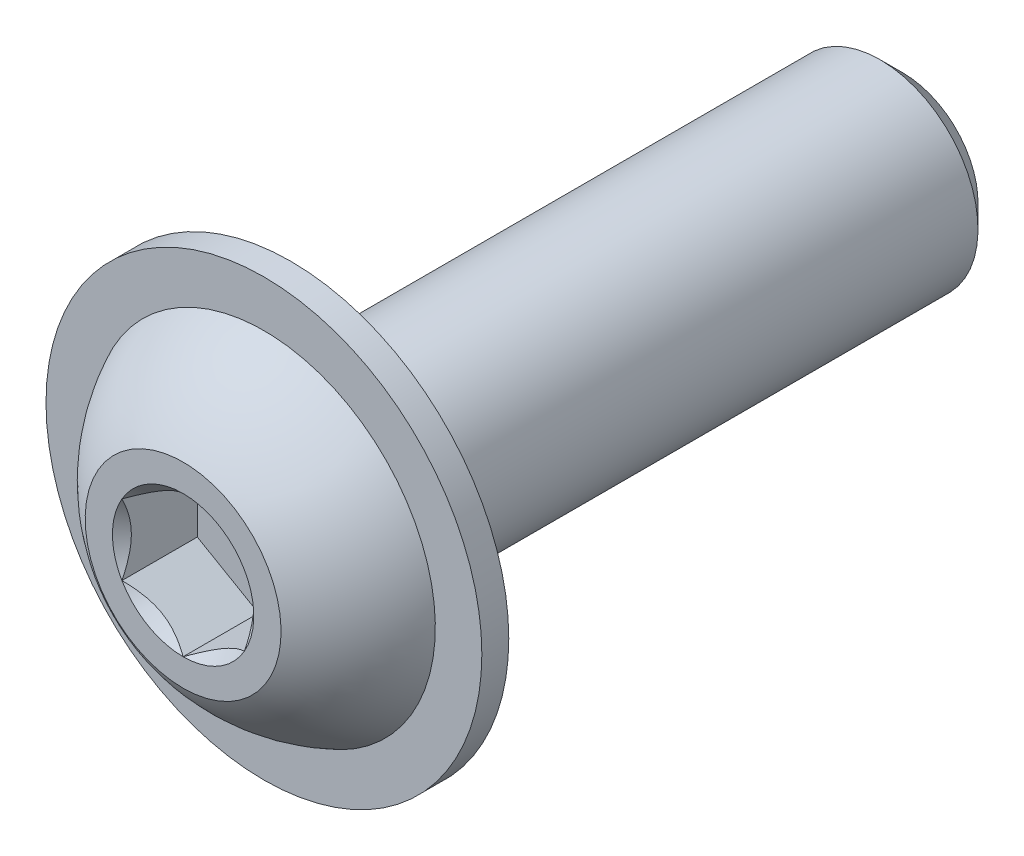
ISO-10303-21;
HEADER;
FILE_DESCRIPTION(('STEP AP214'),'2;1');
FILE_NAME('part.step','',(''),(''),'','','');
FILE_SCHEMA(('AUTOMOTIVE_DESIGN { 1 0 10303 214 1 1 1 1 }'));
ENDSEC;
DATA;
#1=APPLICATION_CONTEXT('core data for automotive mechanical design processes');
#2=APPLICATION_PROTOCOL_DEFINITION('international standard','automotive_design',2000,#1);
#3=PRODUCT_CONTEXT('',#1,'mechanical');
#4=PRODUCT('Part','Part','',(#3));
#5=PRODUCT_RELATED_PRODUCT_CATEGORY('part','',(#4));
#6=PRODUCT_DEFINITION_FORMATION('','',#4);
#7=PRODUCT_DEFINITION_CONTEXT('part definition',#1,'design');
#8=PRODUCT_DEFINITION('design','',#6,#7);
#9=PRODUCT_DEFINITION_SHAPE('','',#8);
#10=(LENGTH_UNIT() NAMED_UNIT(*) SI_UNIT(.MILLI.,.METRE.));
#11=(NAMED_UNIT(*) PLANE_ANGLE_UNIT() SI_UNIT($,.RADIAN.));
#12=(NAMED_UNIT(*) SI_UNIT($,.STERADIAN.) SOLID_ANGLE_UNIT());
#13=UNCERTAINTY_MEASURE_WITH_UNIT(LENGTH_MEASURE(1.E-05),#10,'distance_accuracy_value','');
#14=(GEOMETRIC_REPRESENTATION_CONTEXT(3) GLOBAL_UNCERTAINTY_ASSIGNED_CONTEXT((#13)) GLOBAL_UNIT_ASSIGNED_CONTEXT((#10,
#11,#12)) REPRESENTATION_CONTEXT('',''));
#15=CARTESIAN_POINT('',(0.,0.,0.));
#16=DIRECTION('',(0.,0.,1.));
#17=DIRECTION('',(1.,0.,0.));
#18=AXIS2_PLACEMENT_3D('',#15,#16,#17);
#19=CARTESIAN_POINT('',(0.,-4.,-29.4));
#20=DIRECTION('',(0.,0.,-1.));
#21=DIRECTION('',(0.,1.,0.));
#22=AXIS2_PLACEMENT_3D('',#19,#20,#21);
#23=PLANE('',#22);
#24=CARTESIAN_POINT('',(0.,0.,-29.4));
#25=DIRECTION('',(0.,0.,-1.));
#26=DIRECTION('',(0.,1.,0.));
#27=AXIS2_PLACEMENT_3D('',#24,#25,#26);
#28=CIRCLE('',#27,3.0625);
#29=CARTESIAN_POINT('',(0.,3.0625,-29.4));
#30=VERTEX_POINT('',#29);
#31=EDGE_CURVE('E180',#30,#30,#28,.T.);
#32=ORIENTED_EDGE('',*,*,#31,.T.);
#33=EDGE_LOOP('',(#32));
#34=FACE_BOUND('',#33,.T.);
#35=ADVANCED_FACE('F37',(#34),#23,.T.);
#36=CARTESIAN_POINT('',(0.,0.,-29.4));
#37=DIRECTION('',(0.,0.,-1.));
#38=DIRECTION('',(0.,1.,0.));
#39=AXIS2_PLACEMENT_3D('',#36,#37,#38);
#40=CYLINDRICAL_SURFACE('',#39,4.);
#41=CARTESIAN_POINT('',(0.,0.,-28.4625));
#42=DIRECTION('',(0.,0.,-1.));
#43=DIRECTION('',(0.,1.,0.));
#44=AXIS2_PLACEMENT_3D('',#41,#42,#43);
#45=CIRCLE('',#44,4.);
#46=CARTESIAN_POINT('',(0.,4.,-28.4625));
#47=VERTEX_POINT('',#46);
#48=EDGE_CURVE('E51',#47,#47,#45,.F.);
#49=ORIENTED_EDGE('',*,*,#48,.T.);
#50=EDGE_LOOP('',(#49));
#51=FACE_BOUND('',#50,.T.);
#52=CARTESIAN_POINT('',(0.,0.,-4.4));
#53=DIRECTION('',(0.,0.,1.));
#54=DIRECTION('',(1.,0.,0.));
#55=AXIS2_PLACEMENT_3D('',#52,#53,#54);
#56=CIRCLE('',#55,4.);
#57=CARTESIAN_POINT('',(4.,0.,-4.4));
#58=VERTEX_POINT('',#57);
#59=EDGE_CURVE('E177',#58,#58,#56,.F.);
#60=ORIENTED_EDGE('',*,*,#59,.T.);
#61=EDGE_LOOP('',(#60));
#62=FACE_BOUND('',#61,.T.);
#63=ADVANCED_FACE('F185',(#51,#62),#40,.T.);
#64=CARTESIAN_POINT('',(0.,0.,-29.4));
#65=DIRECTION('',(0.,0.,1.));
#66=DIRECTION('',(0.,-1.,0.));
#67=AXIS2_PLACEMENT_3D('',#64,#65,#66);
#68=CONICAL_SURFACE('',#67,3.0625,0.785398163397448);
#69=ORIENTED_EDGE('',*,*,#48,.F.);
#70=EDGE_LOOP('',(#69));
#71=FACE_BOUND('',#70,.T.);
#72=ORIENTED_EDGE('',*,*,#31,.F.);
#73=EDGE_LOOP('',(#72));
#74=FACE_BOUND('',#73,.T.);
#75=ADVANCED_FACE('F39',(#71,#74),#68,.T.);
#76=CARTESIAN_POINT('',(0.,-7.,-4.4));
#77=DIRECTION('',(0.,0.,1.));
#78=DIRECTION('',(1.,0.,0.));
#79=AXIS2_PLACEMENT_3D('',#76,#77,#78);
#80=PLANE('',#79);
#81=ORIENTED_EDGE('',*,*,#59,.F.);
#82=EDGE_LOOP('',(#81));
#83=FACE_BOUND('',#82,.T.);
#84=CARTESIAN_POINT('',(0.,0.,-4.4));
#85=DIRECTION('',(0.,0.,-1.));
#86=DIRECTION('',(-1.,0.,0.));
#87=AXIS2_PLACEMENT_3D('',#84,#85,#86);
#88=CIRCLE('',#87,8.9);
#89=CARTESIAN_POINT('',(-8.9,0.,-4.4));
#90=VERTEX_POINT('',#89);
#91=EDGE_CURVE('E169',#90,#90,#88,.T.);
#92=ORIENTED_EDGE('',*,*,#91,.T.);
#93=EDGE_LOOP('',(#92));
#94=FACE_BOUND('',#93,.T.);
#95=ADVANCED_FACE('F190',(#83,#94),#80,.F.);
#96=CARTESIAN_POINT('',(0.,0.,-3.3));
#97=DIRECTION('',(0.,0.,-1.));
#98=DIRECTION('',(-1.,0.,0.));
#99=AXIS2_PLACEMENT_3D('',#96,#97,#98);
#100=PLANE('',#99);
#101=CARTESIAN_POINT('',(0.,0.,-3.3));
#102=DIRECTION('',(0.,0.,-1.));
#103=DIRECTION('',(-1.,0.,0.));
#104=AXIS2_PLACEMENT_3D('',#101,#102,#103);
#105=CIRCLE('',#104,8.9);
#106=CARTESIAN_POINT('',(-8.9,0.,-3.3));
#107=VERTEX_POINT('',#106);
#108=EDGE_CURVE('E165',#107,#107,#105,.T.);
#109=ORIENTED_EDGE('',*,*,#108,.F.);
#110=EDGE_LOOP('',(#109));
#111=FACE_BOUND('',#110,.T.);
#112=CARTESIAN_POINT('',(0.,0.,-3.3));
#113=DIRECTION('',(0.,0.,-1.));
#114=DIRECTION('',(-1.,0.,0.));
#115=AXIS2_PLACEMENT_3D('',#112,#113,#114);
#116=CIRCLE('',#115,7.);
#117=CARTESIAN_POINT('',(0.,-7.,-3.3));
#118=VERTEX_POINT('',#117);
#119=EDGE_CURVE('E168',#118,#118,#116,.T.);
#120=ORIENTED_EDGE('',*,*,#119,.T.);
#121=EDGE_LOOP('',(#120));
#122=FACE_BOUND('',#121,.T.);
#123=ADVANCED_FACE('F208',(#111,#122),#100,.F.);
#124=CARTESIAN_POINT('',(0.,0.,-3.3));
#125=DIRECTION('',(0.,0.,-1.));
#126=DIRECTION('',(-1.,0.,0.));
#127=AXIS2_PLACEMENT_3D('',#124,#125,#126);
#128=CYLINDRICAL_SURFACE('',#127,8.9);
#129=ORIENTED_EDGE('',*,*,#108,.T.);
#130=EDGE_LOOP('',(#129));
#131=FACE_BOUND('',#130,.T.);
#132=ORIENTED_EDGE('',*,*,#91,.F.);
#133=EDGE_LOOP('',(#132));
#134=FACE_BOUND('',#133,.T.);
#135=ADVANCED_FACE('F205',(#131,#134),#128,.T.);
#136=CARTESIAN_POINT('',(0.,-4.,0.));
#137=DIRECTION('',(0.,0.,-1.));
#138=DIRECTION('',(-1.,0.,0.));
#139=AXIS2_PLACEMENT_3D('',#136,#137,#138);
#140=PLANE('',#139);
#141=CARTESIAN_POINT('',(0.,0.,0.));
#142=DIRECTION('',(0.,0.,1.));
#143=DIRECTION('',(1.,0.,0.));
#144=AXIS2_PLACEMENT_3D('',#141,#142,#143);
#145=CIRCLE('',#144,2.88675134594813);
#146=CARTESIAN_POINT('',(-2.5,1.44337567297406,0.));
#147=VERTEX_POINT('',#146);
#148=CARTESIAN_POINT('',(-2.5,-1.44337567297406,0.));
#149=VERTEX_POINT('',#148);
#150=EDGE_CURVE('E64',#147,#149,#145,.T.);
#151=ORIENTED_EDGE('',*,*,#150,.F.);
#152=CARTESIAN_POINT('',(0.,2.88675134594813,0.));
#153=VERTEX_POINT('',#152);
#154=EDGE_CURVE('E136',#153,#147,#145,.T.);
#155=ORIENTED_EDGE('',*,*,#154,.F.);
#156=CARTESIAN_POINT('',(2.5,1.44337567297407,0.));
#157=VERTEX_POINT('',#156);
#158=EDGE_CURVE('E133',#157,#153,#145,.T.);
#159=ORIENTED_EDGE('',*,*,#158,.F.);
#160=CARTESIAN_POINT('',(2.5,-1.44337567297407,0.));
#161=VERTEX_POINT('',#160);
#162=EDGE_CURVE('E104',#161,#157,#145,.T.);
#163=ORIENTED_EDGE('',*,*,#162,.F.);
#164=CARTESIAN_POINT('',(0.,-2.88675134594813,0.));
#165=VERTEX_POINT('',#164);
#166=EDGE_CURVE('E96',#165,#161,#145,.T.);
#167=ORIENTED_EDGE('',*,*,#166,.F.);
#168=EDGE_CURVE('E57',#149,#165,#145,.T.);
#169=ORIENTED_EDGE('',*,*,#168,.F.);
#170=EDGE_LOOP('',(#151,#155,#159,#163,#167,#169));
#171=FACE_BOUND('',#170,.T.);
#172=CARTESIAN_POINT('',(0.,0.,0.));
#173=DIRECTION('',(0.,0.,1.));
#174=DIRECTION('',(1.,0.,0.));
#175=AXIS2_PLACEMENT_3D('',#172,#173,#174);
#176=CIRCLE('',#175,4.);
#177=CARTESIAN_POINT('',(0.,-4.,0.));
#178=VERTEX_POINT('',#177);
#179=EDGE_CURVE('E174',#178,#178,#176,.T.);
#180=ORIENTED_EDGE('',*,*,#179,.T.);
#181=EDGE_LOOP('',(#180));
#182=FACE_BOUND('',#181,.T.);
#183=ADVANCED_FACE('F130',(#171,#182),#140,.F.);
#184=CARTESIAN_POINT('',(0.,0.,-6.65));
#185=DIRECTION('',(0.,0.,1.));
#186=DIRECTION('',(0.,-1.,0.));
#187=AXIS2_PLACEMENT_3D('',#184,#185,#186);
#188=SPHERICAL_SURFACE('',#187,7.76031571522705);
#189=CARTESIAN_POINT('',(0.,-4.,0.));
#190=CARTESIAN_POINT('',(0.,-4.04037893719845,-0.0242880228539728));
#191=CARTESIAN_POINT('',(0.,-4.08053660493613,-0.0489439030561399));
#192=CARTESIAN_POINT('',(0.,-4.16039619582764,-0.0989830066171546));
#193=CARTESIAN_POINT('',(0.,-4.20009811898147,-0.124366229976002));
#194=CARTESIAN_POINT('',(0.,-4.27903301504297,-0.175851648310671));
#195=CARTESIAN_POINT('',(0.,-4.31826598795065,-0.201953843286492));
#196=CARTESIAN_POINT('',(0.,-4.39624997398247,-0.254868530081807));
#197=CARTESIAN_POINT('',(0.,-4.43500098710662,-0.2816810219013));
#198=CARTESIAN_POINT('',(0.,-4.51200819309834,-0.336007409250996));
#199=CARTESIAN_POINT('',(0.,-4.55026438596591,-0.363521304781198));
#200=CARTESIAN_POINT('',(0.,-4.62626925806954,-0.419241369039931));
#201=CARTESIAN_POINT('',(0.,-4.6640179373056,-0.447447537768461));
#202=CARTESIAN_POINT('',(0.,-4.73899525639257,-0.504542789448714));
#203=CARTESIAN_POINT('',(0.,-4.77622389624346,-0.533431872400436));
#204=CARTESIAN_POINT('',(0.,-4.85014878357232,-0.5918833666172));
#205=CARTESIAN_POINT('',(0.,-4.88684503105029,-0.621445777882243));
#206=CARTESIAN_POINT('',(0.,-4.95969295724547,-0.681234119484474));
#207=CARTESIAN_POINT('',(0.,-4.99584463596268,-0.711460049821662));
#208=CARTESIAN_POINT('',(0.,-5.0675914289598,-0.772565400137301));
#209=CARTESIAN_POINT('',(0.,-5.1031865432397,-0.803444820115751));
#210=CARTESIAN_POINT('',(0.,-5.1738083963582,-0.865846903451588));
#211=CARTESIAN_POINT('',(0.,-5.20883513519678,-0.897369566808975));
#212=CARTESIAN_POINT('',(0.,-5.27830861502539,-0.961047677200656));
#213=CARTESIAN_POINT('',(0.,-5.3127553560154,-0.99320312423495));
#214=CARTESIAN_POINT('',(0.,-5.38105741019146,-1.05813613231157));
#215=CARTESIAN_POINT('',(0.,-5.4149127233775,-1.0909136933539));
#216=CARTESIAN_POINT('',(0.,-5.48202068823509,-1.15708005335067));
#217=CARTESIAN_POINT('',(0.,-5.51527333990663,-1.1904688523051));
#218=CARTESIAN_POINT('',(0.,-5.58116494799698,-1.25784660921209));
#219=CARTESIAN_POINT('',(0.,-5.61380390441577,-1.29183556716464));
#220=CARTESIAN_POINT('',(0.,-5.67845729189585,-1.36040236401194));
#221=CARTESIAN_POINT('',(0.,-5.71047172295714,-1.39498020290669));
#222=CARTESIAN_POINT('',(0.,-5.77386543684447,-1.46471328818276));
#223=CARTESIAN_POINT('',(0.,-5.80524471967052,-1.49986853456408));
#224=CARTESIAN_POINT('',(0.,-5.86735772496159,-1.57074476976503));
#225=CARTESIAN_POINT('',(0.,-5.89809144742659,-1.60646575858467));
#226=CARTESIAN_POINT('',(0.,-5.95890313407655,-1.67846162589201));
#227=CARTESIAN_POINT('',(0.,-5.9889810982615,-1.71473650437972));
#228=CARTESIAN_POINT('',(0.,-6.04847128802294,-1.78782811446389));
#229=CARTESIAN_POINT('',(0.,-6.07788351359943,-1.82464484606035));
#230=CARTESIAN_POINT('',(0.,-6.13603246671781,-1.8988079460076));
#231=CARTESIAN_POINT('',(0.,-6.16476919425968,-1.93615431435838));
#232=CARTESIAN_POINT('',(0.,-6.22155761602334,-2.01136429571819));
#233=CARTESIAN_POINT('',(0.,-6.24960931024513,-2.04922790872721));
#234=CARTESIAN_POINT('',(0.,-6.30501835738719,-2.12545981567799));
#235=CARTESIAN_POINT('',(0.,-6.33237571030747,-2.16382810961973));
#236=CARTESIAN_POINT('',(0.,-6.38638699725996,-2.24105664724867));
#237=CARTESIAN_POINT('',(0.,-6.41304093129218,-2.27991689093586));
#238=CARTESIAN_POINT('',(0.,-6.46563653628037,-2.35811643363534));
#239=CARTESIAN_POINT('',(0.,-6.49157820723636,-2.39745573264764));
#240=CARTESIAN_POINT('',(0.,-6.54274067824895,-2.47660033260647));
#241=CARTESIAN_POINT('',(0.,-6.56796147830555,-2.516405633553));
#242=CARTESIAN_POINT('',(0.,-6.61767383879799,-2.59646902941009));
#243=CARTESIAN_POINT('',(0.,-6.64216539923383,-2.63672712432065));
#244=CARTESIAN_POINT('',(0.,-6.69041115408788,-2.71768274971537));
#245=CARTESIAN_POINT('',(0.,-6.71416534850609,-2.75838028019953));
#246=CARTESIAN_POINT('',(0.,-6.76092848828486,-2.84020127319737));
#247=CARTESIAN_POINT('',(0.,-6.78393743364541,-2.88132473571104));
#248=CARTESIAN_POINT('',(0.,-6.8292024444522,-2.9639839454382));
#249=CARTESIAN_POINT('',(0.,-6.85145850989844,-3.00551969265169));
#250=CARTESIAN_POINT('',(0.,-6.89521036155606,-3.08898969680806));
#251=CARTESIAN_POINT('',(0.,-6.91670614776745,-3.13092395375095));
#252=CARTESIAN_POINT('',(0.,-6.95893036213262,-3.21517703597228));
#253=CARTESIAN_POINT('',(0.,-6.9796587902864,-3.25749586125072));
#254=CARTESIAN_POINT('',(0.,-7.,-3.3));
#255=B_SPLINE_CURVE_WITH_KNOTS('',3,(#189,#190,#191,#192,#193,#194,#195,#196,#197,#198,#199,
#200,#201,#202,#203,#204,#205,#206,#207,#208,#209,#210,#211,#212,#213,#214,#215,#216,#217,#218,
#219,#220,#221,#222,#223,#224,#225,#226,#227,#228,#229,#230,#231,#232,#233,#234,#235,#236,#237,
#238,#239,#240,#241,#242,#243,#244,#245,#246,#247,#248,#249,#250,#251,#252,#253,#254),
.UNSPECIFIED.,.F.,.F.,(4,2,2,2,2,2,2,2,2,2,2,2,2,2,2,2,2,2,2,2,2,2,2,2,2,2,2,2,2,2,2,2,4),(0.,
0.141360341936276,0.282720683872551,0.424081025808829,0.565441367745104,0.70680170968138,
0.848162051617655,0.989522393553932,1.13088273549021,1.27224307742648,1.41360341936276,
1.55496376129904,1.69632410323531,1.83768444517159,1.97904478710786,2.12040512904414,
2.26176547098042,2.40312581291669,2.54448615485297,2.68584649678924,2.82720683872552,
2.9685671806618,3.10992752259807,3.25128786453435,3.39264820647062,3.5340085484069,
3.67536889034318,3.81672923227945,3.95808957421573,4.099449916152,4.24081025808828,
4.38217060002455,4.52353094196083),.UNSPECIFIED.);
#256=EDGE_CURVE('BSEAM199',#178,#118,#255,.T.);
#257=ORIENTED_EDGE('',*,*,#179,.F.);
#258=ORIENTED_EDGE('',*,*,#119,.F.);
#259=ORIENTED_EDGE('',*,*,#256,.T.);
#260=ORIENTED_EDGE('',*,*,#256,.F.);
#261=EDGE_LOOP('',(#257,#259,#258,#260));
#262=FACE_BOUND('',#261,.T.);
#263=ADVANCED_FACE('F199',(#262),#188,.T.);
#264=CARTESIAN_POINT('',(0.,0.,0.));
#265=DIRECTION('',(0.,0.,1.));
#266=DIRECTION('',(1.,0.,0.));
#267=AXIS2_PLACEMENT_3D('',#264,#265,#266);
#268=CONICAL_SURFACE('',#267,2.88675134594813,0.78539816339745);
#269=ORIENTED_EDGE('',*,*,#162,.T.);
#270=CARTESIAN_POINT('',(2.5,-2.87868021616154,0.925964193784652));
#271=CARTESIAN_POINT('',(2.5,-2.80858751756355,0.873054769399491));
#272=CARTESIAN_POINT('',(2.5,-2.73810237384457,0.820656784806445));
#273=CARTESIAN_POINT('',(2.5,-2.59619238907469,0.717112683515218));
#274=CARTESIAN_POINT('',(2.5,-2.52476731657143,0.665966884377932));
#275=CARTESIAN_POINT('',(2.5,-2.38030019419698,0.564792497981434));
#276=CARTESIAN_POINT('',(2.5,-2.30724990359399,0.51477563778446));
#277=CARTESIAN_POINT('',(2.5,-2.15990937397294,0.416608843915506));
#278=CARTESIAN_POINT('',(2.5,-2.08561922308943,0.368458778345536));
#279=CARTESIAN_POINT('',(2.5,-1.93130274871408,0.271746559451961));
#280=CARTESIAN_POINT('',(2.5,-1.8511916849785,0.223318932537291));
#281=CARTESIAN_POINT('',(2.5,-1.68912282627168,0.129664059704143));
#282=CARTESIAN_POINT('',(2.5,-1.60716527674864,0.0844363916948273));
#283=CARTESIAN_POINT('',(2.5,-1.44137668632319,-0.00186462533073074));
#284=CARTESIAN_POINT('',(2.5,-1.35755175925796,-0.0429496273364138));
#285=CARTESIAN_POINT('',(2.5,-1.1876157775942,-0.120038133893405));
#286=CARTESIAN_POINT('',(2.5,-1.10150577924729,-0.156043939265442));
#287=CARTESIAN_POINT('',(2.5,-0.933895283730373,-0.219050255714909));
#288=CARTESIAN_POINT('',(2.5,-0.852581486652411,-0.246542279856903));
#289=CARTESIAN_POINT('',(2.5,-0.687996185051425,-0.295002885582603));
#290=CARTESIAN_POINT('',(2.5,-0.604724546085162,-0.315971017761043));
#291=CARTESIAN_POINT('',(2.5,-0.438105786501648,-0.349940004986968));
#292=CARTESIAN_POINT('',(2.5,-0.35478695737788,-0.363077366556389));
#293=CARTESIAN_POINT('',(2.5,-0.18725863826877,-0.381129805600402));
#294=CARTESIAN_POINT('',(2.5,-0.103049303891731,-0.386046296469838));
#295=CARTESIAN_POINT('',(2.5,0.0623819458555509,-0.387291925628102));
#296=CARTESIAN_POINT('',(2.5,0.143601667742496,-0.383925448289117));
#297=CARTESIAN_POINT('',(2.5,0.305344840533966,-0.369462407619085));
#298=CARTESIAN_POINT('',(2.5,0.385868223029659,-0.358365093346908));
#299=CARTESIAN_POINT('',(2.5,0.546999992477732,-0.328857921414662));
#300=CARTESIAN_POINT('',(2.5,0.627585258156381,-0.310323623169081));
#301=CARTESIAN_POINT('',(2.5,0.786991930978588,-0.266927667985933));
#302=CARTESIAN_POINT('',(2.5,0.865813485110826,-0.242066540482562));
#303=CARTESIAN_POINT('',(2.5,1.11399280220491,-0.154441088760136));
#304=CARTESIAN_POINT('',(2.5,1.27984027529456,-0.0816966645253836));
#305=CARTESIAN_POINT('',(2.5,1.52253018655038,0.0395423452678442));
#306=CARTESIAN_POINT('',(2.5,1.60256472908879,0.0820714512072038));
#307=CARTESIAN_POINT('',(2.5,1.76081489282125,0.170396524152192));
#308=CARTESIAN_POINT('',(2.5,1.83903083842887,0.216191902476713));
#309=CARTESIAN_POINT('',(2.5,1.99000684607168,0.308044678728649));
#310=CARTESIAN_POINT('',(2.5,2.06284472030444,0.353975635424459));
#311=CARTESIAN_POINT('',(2.5,2.20727164736135,0.447770245386506));
#312=CARTESIAN_POINT('',(2.5,2.27886060500402,0.49563404504362));
#313=CARTESIAN_POINT('',(2.5,2.42037078548403,0.592552236318334));
#314=CARTESIAN_POINT('',(2.5,2.49030083172878,0.64159379831621));
#315=CARTESIAN_POINT('',(2.5,2.62920524991558,0.740973835189781));
#316=CARTESIAN_POINT('',(2.5,2.69817987937839,0.791311949707409));
#317=CARTESIAN_POINT('',(2.5,2.76675463365823,0.842180297682427));
#318=B_SPLINE_CURVE_WITH_KNOTS('',3,(#270,#271,#272,#273,#274,#275,#276,#277,#278,#279,#280,
#281,#282,#283,#284,#285,#286,#287,#288,#289,#290,#291,#292,#293,#294,#295,#296,#297,#298,#299,
#300,#301,#302,#303,#304,#305,#306,#307,#308,#309,#310,#311,#312,#313,#314,#315,#316,#317),
.UNSPECIFIED.,.F.,.F.,(4,2,2,2,2,2,2,2,2,2,2,2,2,2,2,2,2,2,2,2,2,2,2,4),(0.,0.263465914971114,
0.526997968323236,0.792571943279359,1.05812711983771,1.33890112548018,1.61963802629079,
1.89956181222216,2.17935838571897,2.436638876826,2.69393708705247,2.94660788173135,
3.19923523085015,3.44271854486786,3.68622551313359,3.93398926860572,4.18173229781968,
4.72334004841907,4.99521600382014,5.26704308216966,5.52534341671993,5.78366335141086,
6.03988492204046,6.29603603207541),.UNSPECIFIED.);
#319=EDGE_CURVE('E11',#161,#157,#318,.T.);
#320=ORIENTED_EDGE('',*,*,#319,.F.);
#321=EDGE_LOOP('',(#269,#320));
#322=FACE_BOUND('',#321,.T.);
#323=ADVANCED_FACE('F108',(#322),#268,.F.);
#324=ORIENTED_EDGE('',*,*,#158,.T.);
#325=CARTESIAN_POINT('',(2.5002,1.44326020292023,0.000115476981764196));
#326=CARTESIAN_POINT('',(2.41426172221224,1.49287669073469,-0.0494592946452729));
#327=CARTESIAN_POINT('',(2.32688643272425,1.5433228376411,-0.0961225186374943));
#328=CARTESIAN_POINT('',(2.14871854383441,1.64618811625259,-0.181561859961699));
#329=CARTESIAN_POINT('',(2.05790899931893,1.6986170312236,-0.220290437593998));
#330=CARTESIAN_POINT('',(1.87479587687308,1.80433744175986,-0.286633296102261));
#331=CARTESIAN_POINT('',(1.78253893547066,1.85760201171316,-0.314414331469144));
#332=CARTESIAN_POINT('',(1.59599399122371,1.96530378549009,-0.357216824089334));
#333=CARTESIAN_POINT('',(1.50171168743372,2.01973769896307,-0.372270233328655));
#334=CARTESIAN_POINT('',(1.33922174170815,2.11355131286833,-0.385852277790518));
#335=CARTESIAN_POINT('',(1.27122403211985,2.15280980880341,-0.387862900759198));
#336=CARTESIAN_POINT('',(1.13533975883078,2.23126263056549,-0.384475882812511));
#337=CARTESIAN_POINT('',(1.06745324244776,2.27045692907358,-0.379075644700179));
#338=CARTESIAN_POINT('',(0.932321211763893,2.34847544336505,-0.361174211597527));
#339=CARTESIAN_POINT('',(0.865076500246438,2.38729919566123,-0.348665072953518));
#340=CARTESIAN_POINT('',(0.7317498991818,2.46427534467604,-0.317232498044292));
#341=CARTESIAN_POINT('',(0.665667920900341,2.50242779262542,-0.298309553503181));
#342=CARTESIAN_POINT('',(0.496403653308734,2.60015256308362,-0.242132638591752));
#343=CARTESIAN_POINT('',(0.394270877777106,2.65911894852989,-0.200644168403812));
#344=CARTESIAN_POINT('',(0.24409358505949,2.74582384890657,-0.130605953276911));
#345=CARTESIAN_POINT('',(0.19460346011739,2.77439698586412,-0.105997747883925));
#346=CARTESIAN_POINT('',(0.0965399361611527,2.83101398781794,-0.054538113284764));
#347=CARTESIAN_POINT('',(0.0479659965030715,2.85905816495513,-0.0276880612206439));
#348=CARTESIAN_POINT('',(-0.00020000000000074,2.88686681600197,0.000115476981763729));
#349=B_SPLINE_CURVE_WITH_KNOTS('',3,(#325,#326,#327,#328,#329,#330,#331,#332,#333,#334,#335,
#336,#337,#338,#339,#340,#341,#342,#343,#344,#345,#346,#347,#348),.UNSPECIFIED.,.F.,.F.,(4,2,2,
2,2,2,2,2,2,2,2,4),(0.,0.333012085133925,0.667964518301397,0.9975970320433,1.32639954393844,
1.56169424147169,1.79707142102083,2.03271213522171,2.26833478775651,2.64260240809533,
2.82922877818864,3.01574133749025),.UNSPECIFIED.);
#350=EDGE_CURVE('E135',#157,#153,#349,.T.);
#351=ORIENTED_EDGE('',*,*,#350,.F.);
#352=EDGE_LOOP('',(#324,#351));
#353=FACE_BOUND('',#352,.T.);
#354=ADVANCED_FACE('F296',(#353),#268,.F.);
#355=ORIENTED_EDGE('',*,*,#154,.T.);
#356=CARTESIAN_POINT('',(0.00019999999999927,2.88686681600197,0.000115476981764065));
#357=CARTESIAN_POINT('',(-0.0857382777877657,2.83725032818751,-0.0494592946452732));
#358=CARTESIAN_POINT('',(-0.173113567275754,2.7868041812811,-0.0961225186374946));
#359=CARTESIAN_POINT('',(-0.35128145616559,2.6839389026696,-0.181561859961699));
#360=CARTESIAN_POINT('',(-0.442091000681076,2.6315099876986,-0.220290437593998));
#361=CARTESIAN_POINT('',(-0.625204123126923,2.52578957716234,-0.286633296102262));
#362=CARTESIAN_POINT('',(-0.717461064529342,2.47252500720904,-0.314414331469144));
#363=CARTESIAN_POINT('',(-0.904006008776287,2.3648232334321,-0.357216824089334));
#364=CARTESIAN_POINT('',(-0.998288312566285,2.31038931995913,-0.372270233328656));
#365=CARTESIAN_POINT('',(-1.16077825829185,2.21657570605387,-0.385852277790518));
#366=CARTESIAN_POINT('',(-1.22877596788015,2.17731721011878,-0.387862900759198));
#367=CARTESIAN_POINT('',(-1.36466024116922,2.0988643883567,-0.384475882812511));
#368=CARTESIAN_POINT('',(-1.43254675755224,2.05967008984862,-0.379075644700179));
#369=CARTESIAN_POINT('',(-1.56767878823611,1.98165157555715,-0.361174211597527));
#370=CARTESIAN_POINT('',(-1.63492349975356,1.94282782326096,-0.348665072953518));
#371=CARTESIAN_POINT('',(-1.7682501008182,1.86585167424616,-0.317232498044292));
#372=CARTESIAN_POINT('',(-1.83433207909966,1.82769922629678,-0.298309553503181));
#373=CARTESIAN_POINT('',(-2.00359634669127,1.72997445583858,-0.242132638591752));
#374=CARTESIAN_POINT('',(-2.10572912222289,1.67100807039231,-0.200644168403812));
#375=CARTESIAN_POINT('',(-2.25590641494051,1.58430317001562,-0.130605953276911));
#376=CARTESIAN_POINT('',(-2.30539653988261,1.55573003305807,-0.105997747883926));
#377=CARTESIAN_POINT('',(-2.40346006383885,1.49911303110425,-0.0545381132847641));
#378=CARTESIAN_POINT('',(-2.45203400349693,1.47106885396706,-0.0276880612206439));
#379=CARTESIAN_POINT('',(-2.5002,1.44326020292023,0.000115476981763847));
#380=B_SPLINE_CURVE_WITH_KNOTS('',3,(#356,#357,#358,#359,#360,#361,#362,#363,#364,#365,#366,
#367,#368,#369,#370,#371,#372,#373,#374,#375,#376,#377,#378,#379),.UNSPECIFIED.,.F.,.F.,(4,2,2,
2,2,2,2,2,2,2,2,4),(0.,0.333012085133925,0.667964518301398,0.9975970320433,1.32639954393844,
1.56169424147169,1.79707142102083,2.03271213522171,2.26833478775651,2.64260240809533,
2.82922877818864,3.01574133749025),.UNSPECIFIED.);
#381=EDGE_CURVE('E140',#153,#147,#380,.T.);
#382=ORIENTED_EDGE('',*,*,#381,.F.);
#383=EDGE_LOOP('',(#355,#382));
#384=FACE_BOUND('',#383,.T.);
#385=ADVANCED_FACE('F143',(#384),#268,.F.);
#386=ORIENTED_EDGE('',*,*,#150,.T.);
#387=CARTESIAN_POINT('',(-2.5,-2.87868021616154,0.925964193784654));
#388=CARTESIAN_POINT('',(-2.5,-2.80858751756355,0.873054769399493));
#389=CARTESIAN_POINT('',(-2.5,-2.73810237384458,0.820656784806447));
#390=CARTESIAN_POINT('',(-2.5,-2.59619238907469,0.71711268351522));
#391=CARTESIAN_POINT('',(-2.5,-2.52476731657143,0.665966884377933));
#392=CARTESIAN_POINT('',(-2.5,-2.38030019419698,0.564792497981435));
#393=CARTESIAN_POINT('',(-2.5,-2.307249903594,0.514775637784461));
#394=CARTESIAN_POINT('',(-2.5,-2.15990937397294,0.416608843915507));
#395=CARTESIAN_POINT('',(-2.5,-2.08561922308943,0.368458778345536));
#396=CARTESIAN_POINT('',(-2.5,-1.93130274871408,0.271746559451961));
#397=CARTESIAN_POINT('',(-2.5,-1.8511916849785,0.223318932537291));
#398=CARTESIAN_POINT('',(-2.5,-1.68912282627168,0.129664059704144));
#399=CARTESIAN_POINT('',(-2.5,-1.60716527674864,0.0844363916948281));
#400=CARTESIAN_POINT('',(-2.5,-1.44137668632319,-0.0018646253307299));
#401=CARTESIAN_POINT('',(-2.5,-1.35755175925796,-0.0429496273364133));
#402=CARTESIAN_POINT('',(-2.5,-1.1876157775942,-0.120038133893405));
#403=CARTESIAN_POINT('',(-2.5,-1.10150577924729,-0.156043939265441));
#404=CARTESIAN_POINT('',(-2.5,-0.933895283730374,-0.219050255714908));
#405=CARTESIAN_POINT('',(-2.5,-0.852581486652412,-0.246542279856903));
#406=CARTESIAN_POINT('',(-2.5,-0.687996185051425,-0.295002885582602));
#407=CARTESIAN_POINT('',(-2.5,-0.604724546085163,-0.315971017761042));
#408=CARTESIAN_POINT('',(-2.5,-0.438105786501649,-0.349940004986968));
#409=CARTESIAN_POINT('',(-2.5,-0.354786957377881,-0.363077366556388));
#410=CARTESIAN_POINT('',(-2.5,-0.187258638268772,-0.381129805600401));
#411=CARTESIAN_POINT('',(-2.5,-0.103049303891732,-0.386046296469837));
#412=CARTESIAN_POINT('',(-2.5,0.0623819458555496,-0.387291925628102));
#413=CARTESIAN_POINT('',(-2.5,0.143601667742495,-0.383925448289116));
#414=CARTESIAN_POINT('',(-2.5,0.305344840533965,-0.369462407619084));
#415=CARTESIAN_POINT('',(-2.5,0.385868223029658,-0.358365093346908));
#416=CARTESIAN_POINT('',(-2.5,0.546999992477731,-0.328857921414662));
#417=CARTESIAN_POINT('',(-2.5,0.62758525815638,-0.310323623169081));
#418=CARTESIAN_POINT('',(-2.5,0.786991930978587,-0.266927667985932));
#419=CARTESIAN_POINT('',(-2.5,0.865813485110825,-0.242066540482562));
#420=CARTESIAN_POINT('',(-2.5,1.11399280220491,-0.154441088760137));
#421=CARTESIAN_POINT('',(-2.5,1.27984027529456,-0.0816966645253839));
#422=CARTESIAN_POINT('',(-2.5,1.52253018655038,0.0395423452678438));
#423=CARTESIAN_POINT('',(-2.5,1.60256472908879,0.0820714512072034));
#424=CARTESIAN_POINT('',(-2.5,1.76081489282124,0.170396524152191));
#425=CARTESIAN_POINT('',(-2.5,1.83903083842886,0.216191902476712));
#426=CARTESIAN_POINT('',(-2.5,1.99000684607167,0.308044678728648));
#427=CARTESIAN_POINT('',(-2.5,2.06284472030444,0.353975635424457));
#428=CARTESIAN_POINT('',(-2.5,2.20727164736135,0.447770245386505));
#429=CARTESIAN_POINT('',(-2.5,2.27886060500402,0.495634045043619));
#430=CARTESIAN_POINT('',(-2.5,2.42037078548403,0.592552236318333));
#431=CARTESIAN_POINT('',(-2.5,2.49030083172878,0.641593798316209));
#432=CARTESIAN_POINT('',(-2.5,2.62920524991558,0.74097383518978));
#433=CARTESIAN_POINT('',(-2.5,2.69817987937839,0.791311949707408));
#434=CARTESIAN_POINT('',(-2.5,2.76675463365823,0.842180297682426));
#435=B_SPLINE_CURVE_WITH_KNOTS('',3,(#387,#388,#389,#390,#391,#392,#393,#394,#395,#396,#397,
#398,#399,#400,#401,#402,#403,#404,#405,#406,#407,#408,#409,#410,#411,#412,#413,#414,#415,#416,
#417,#418,#419,#420,#421,#422,#423,#424,#425,#426,#427,#428,#429,#430,#431,#432,#433,#434),
.UNSPECIFIED.,.F.,.F.,(4,2,2,2,2,2,2,2,2,2,2,2,2,2,2,2,2,2,2,2,2,2,2,4),(0.,0.263465914971114,
0.526997968323237,0.792571943279361,1.05812711983771,1.33890112548018,1.61963802629079,
1.89956181222216,2.17935838571897,2.436638876826,2.69393708705248,2.94660788173135,
3.19923523085016,3.44271854486786,3.68622551313359,3.93398926860573,4.18173229781968,
4.72334004841908,4.99521600382014,5.26704308216966,5.52534341671993,5.78366335141086,
6.03988492204046,6.29603603207541),.UNSPECIFIED.);
#436=EDGE_CURVE('E147',#147,#149,#435,.F.);
#437=ORIENTED_EDGE('',*,*,#436,.F.);
#438=EDGE_LOOP('',(#386,#437));
#439=FACE_BOUND('',#438,.T.);
#440=ADVANCED_FACE('F290',(#439),#268,.F.);
#441=ORIENTED_EDGE('',*,*,#168,.T.);
#442=CARTESIAN_POINT('',(-2.5002,-1.44326020292023,0.000115476981764196));
#443=CARTESIAN_POINT('',(-2.41426172221224,-1.49287669073469,-0.0494592946452727));
#444=CARTESIAN_POINT('',(-2.32688643272425,-1.5433228376411,-0.0961225186374939));
#445=CARTESIAN_POINT('',(-2.14871854383441,-1.64618811625259,-0.181561859961698));
#446=CARTESIAN_POINT('',(-2.05790899931893,-1.69861703122359,-0.220290437593997));
#447=CARTESIAN_POINT('',(-1.87479587687308,-1.80433744175986,-0.286633296102261));
#448=CARTESIAN_POINT('',(-1.78253893547066,-1.85760201171316,-0.314414331469143));
#449=CARTESIAN_POINT('',(-1.59599399122371,-1.96530378549009,-0.357216824089333));
#450=CARTESIAN_POINT('',(-1.50171168743372,-2.01973769896307,-0.372270233328655));
#451=CARTESIAN_POINT('',(-1.33922174170815,-2.11355131286833,-0.385852277790518));
#452=CARTESIAN_POINT('',(-1.27122403211985,-2.15280980880341,-0.387862900759198));
#453=CARTESIAN_POINT('',(-1.13533975883078,-2.23126263056549,-0.384475882812511));
#454=CARTESIAN_POINT('',(-1.06745324244776,-2.27045692907358,-0.379075644700179));
#455=CARTESIAN_POINT('',(-0.932321211763894,-2.34847544336505,-0.361174211597527));
#456=CARTESIAN_POINT('',(-0.865076500246439,-2.38729919566123,-0.348665072953518));
#457=CARTESIAN_POINT('',(-0.7317498991818,-2.46427534467604,-0.317232498044292));
#458=CARTESIAN_POINT('',(-0.665667920900342,-2.50242779262542,-0.29830955350318));
#459=CARTESIAN_POINT('',(-0.496403653308735,-2.60015256308362,-0.242132638591751));
#460=CARTESIAN_POINT('',(-0.394270877777107,-2.65911894852989,-0.200644168403812));
#461=CARTESIAN_POINT('',(-0.244093585059492,-2.74582384890657,-0.130605953276911));
#462=CARTESIAN_POINT('',(-0.194603460117391,-2.77439698586412,-0.105997747883925));
#463=CARTESIAN_POINT('',(-0.0965399361611536,-2.83101398781794,-0.0545381132847639));
#464=CARTESIAN_POINT('',(-0.0479659965030723,-2.85905816495513,-0.0276880612206436));
#465=CARTESIAN_POINT('',(0.000200000000000077,-2.88686681600197,0.000115476981764281));
#466=B_SPLINE_CURVE_WITH_KNOTS('',3,(#442,#443,#444,#445,#446,#447,#448,#449,#450,#451,#452,
#453,#454,#455,#456,#457,#458,#459,#460,#461,#462,#463,#464,#465),.UNSPECIFIED.,.F.,.F.,(4,2,2,
2,2,2,2,2,2,2,2,4),(0.,0.333012085133924,0.667964518301397,0.997597032043299,1.32639954393844,
1.56169424147169,1.79707142102083,2.03271213522171,2.26833478775651,2.64260240809533,
2.82922877818864,3.01574133749025),.UNSPECIFIED.);
#467=EDGE_CURVE('E120',#149,#165,#466,.T.);
#468=ORIENTED_EDGE('',*,*,#467,.F.);
#469=EDGE_LOOP('',(#441,#468));
#470=FACE_BOUND('',#469,.T.);
#471=ADVANCED_FACE('F238',(#470),#268,.F.);
#472=ORIENTED_EDGE('',*,*,#166,.T.);
#473=CARTESIAN_POINT('',(-0.0001999999999998,-2.88686681600197,0.000115476981764499));
#474=CARTESIAN_POINT('',(0.0857382777877651,-2.83725032818751,-0.0494592946452725));
#475=CARTESIAN_POINT('',(0.173113567275754,-2.7868041812811,-0.0961225186374939));
#476=CARTESIAN_POINT('',(0.351281456165589,-2.6839389026696,-0.181561859961699));
#477=CARTESIAN_POINT('',(0.442091000681075,-2.6315099876986,-0.220290437593998));
#478=CARTESIAN_POINT('',(0.625204123126922,-2.52578957716234,-0.286633296102261));
#479=CARTESIAN_POINT('',(0.717461064529341,-2.47252500720904,-0.314414331469144));
#480=CARTESIAN_POINT('',(0.904006008776287,-2.3648232334321,-0.357216824089334));
#481=CARTESIAN_POINT('',(0.998288312566284,-2.31038931995913,-0.372270233328656));
#482=CARTESIAN_POINT('',(1.16077825829185,-2.21657570605387,-0.385852277790518));
#483=CARTESIAN_POINT('',(1.22877596788015,-2.17731721011878,-0.387862900759198));
#484=CARTESIAN_POINT('',(1.36466024116922,-2.0988643883567,-0.384475882812511));
#485=CARTESIAN_POINT('',(1.43254675755224,-2.05967008984862,-0.379075644700178));
#486=CARTESIAN_POINT('',(1.56767878823611,-1.98165157555715,-0.361174211597527));
#487=CARTESIAN_POINT('',(1.63492349975356,-1.94282782326096,-0.348665072953518));
#488=CARTESIAN_POINT('',(1.7682501008182,-1.86585167424616,-0.317232498044292));
#489=CARTESIAN_POINT('',(1.83433207909966,-1.82769922629677,-0.29830955350318));
#490=CARTESIAN_POINT('',(2.00359634669127,-1.72997445583858,-0.242132638591752));
#491=CARTESIAN_POINT('',(2.10572912222289,-1.67100807039231,-0.200644168403812));
#492=CARTESIAN_POINT('',(2.25590641494051,-1.58430317001562,-0.130605953276912));
#493=CARTESIAN_POINT('',(2.30539653988261,-1.55573003305807,-0.105997747883926));
#494=CARTESIAN_POINT('',(2.40346006383885,-1.49911303110426,-0.0545381132847649));
#495=CARTESIAN_POINT('',(2.45203400349693,-1.47106885396706,-0.0276880612206447));
#496=CARTESIAN_POINT('',(2.5002,-1.44326020292023,0.000115476981763247));
#497=B_SPLINE_CURVE_WITH_KNOTS('',3,(#473,#474,#475,#476,#477,#478,#479,#480,#481,#482,#483,
#484,#485,#486,#487,#488,#489,#490,#491,#492,#493,#494,#495,#496),.UNSPECIFIED.,.F.,.F.,(4,2,2,
2,2,2,2,2,2,2,2,4),(0.,0.333012085133924,0.667964518301398,0.9975970320433,1.32639954393844,
1.56169424147169,1.79707142102083,2.03271213522171,2.26833478775651,2.64260240809533,
2.82922877818864,3.01574133749025),.UNSPECIFIED.);
#498=EDGE_CURVE('E100',#165,#161,#497,.T.);
#499=ORIENTED_EDGE('',*,*,#498,.F.);
#500=EDGE_LOOP('',(#472,#499));
#501=FACE_BOUND('',#500,.T.);
#502=ADVANCED_FACE('F98',(#501),#268,.F.);
#503=CARTESIAN_POINT('',(2.5,-1.44337567297406,-3.08));
#504=DIRECTION('',(0.,0.,1.));
#505=DIRECTION('',(1.,0.,0.));
#506=AXIS2_PLACEMENT_3D('',#503,#504,#505);
#507=PLANE('',#506);
#508=DIRECTION('',(0.866025403784438,0.5,0.));
#509=VECTOR('',#508,1.);
#510=CARTESIAN_POINT('',(0.,-2.88675134594813,-3.08));
#511=LINE('',#510,#509);
#512=CARTESIAN_POINT('',(0.,-2.88675134594813,-3.08));
#513=VERTEX_POINT('',#512);
#514=CARTESIAN_POINT('',(2.5,-1.44337567297406,-3.08));
#515=VERTEX_POINT('',#514);
#516=EDGE_CURVE('E119',#513,#515,#511,.T.);
#517=ORIENTED_EDGE('',*,*,#516,.T.);
#518=DIRECTION('',(0.,1.,0.));
#519=VECTOR('',#518,1.);
#520=CARTESIAN_POINT('',(2.5,-1.44337567297406,-3.08));
#521=LINE('',#520,#519);
#522=CARTESIAN_POINT('',(2.5,1.44337567297407,-3.08));
#523=VERTEX_POINT('',#522);
#524=EDGE_CURVE('E124',#515,#523,#521,.T.);
#525=ORIENTED_EDGE('',*,*,#524,.T.);
#526=DIRECTION('',(-0.866025403784439,0.5,0.));
#527=VECTOR('',#526,1.);
#528=CARTESIAN_POINT('',(2.5,1.44337567297407,-3.08));
#529=LINE('',#528,#527);
#530=CARTESIAN_POINT('',(0.,2.88675134594813,-3.08));
#531=VERTEX_POINT('',#530);
#532=EDGE_CURVE('E280',#523,#531,#529,.T.);
#533=ORIENTED_EDGE('',*,*,#532,.T.);
#534=DIRECTION('',(-0.866025403784438,-0.5,0.));
#535=VECTOR('',#534,1.);
#536=CARTESIAN_POINT('',(0.,2.88675134594813,-3.08));
#537=LINE('',#536,#535);
#538=CARTESIAN_POINT('',(-2.5,1.44337567297406,-3.08));
#539=VERTEX_POINT('',#538);
#540=EDGE_CURVE('E156',#531,#539,#537,.T.);
#541=ORIENTED_EDGE('',*,*,#540,.T.);
#542=DIRECTION('',(0.,-1.,0.));
#543=VECTOR('',#542,1.);
#544=CARTESIAN_POINT('',(-2.5,1.44337567297406,-3.08));
#545=LINE('',#544,#543);
#546=CARTESIAN_POINT('',(-2.5,-1.44337567297406,-3.08));
#547=VERTEX_POINT('',#546);
#548=EDGE_CURVE('E284',#539,#547,#545,.T.);
#549=ORIENTED_EDGE('',*,*,#548,.T.);
#550=DIRECTION('',(0.866025403784439,-0.5,0.));
#551=VECTOR('',#550,1.);
#552=CARTESIAN_POINT('',(-2.5,-1.44337567297406,-3.08));
#553=LINE('',#552,#551);
#554=EDGE_CURVE('E127',#547,#513,#553,.T.);
#555=ORIENTED_EDGE('',*,*,#554,.T.);
#556=EDGE_LOOP('',(#517,#525,#533,#541,#549,#555));
#557=FACE_BOUND('',#556,.T.);
#558=ADVANCED_FACE('F237',(#557),#507,.T.);
#559=CARTESIAN_POINT('',(2.5,-1.44337567297406,-3.08));
#560=DIRECTION('',(1.,0.,0.));
#561=DIRECTION('',(0.,0.,-1.));
#562=AXIS2_PLACEMENT_3D('',#559,#560,#561);
#563=PLANE('',#562);
#564=DIRECTION('',(0.,0.,1.));
#565=VECTOR('',#564,1.);
#566=CARTESIAN_POINT('',(2.5,-1.44337567297406,-3.08));
#567=LINE('',#566,#565);
#568=EDGE_CURVE('E116',#515,#161,#567,.T.);
#569=ORIENTED_EDGE('',*,*,#568,.T.);
#570=ORIENTED_EDGE('',*,*,#319,.T.);
#571=DIRECTION('',(0.,0.,1.));
#572=VECTOR('',#571,1.);
#573=CARTESIAN_POINT('',(2.5,1.44337567297407,-3.08));
#574=LINE('',#573,#572);
#575=EDGE_CURVE('E126',#523,#157,#574,.T.);
#576=ORIENTED_EDGE('',*,*,#575,.F.);
#577=ORIENTED_EDGE('',*,*,#524,.F.);
#578=EDGE_LOOP('',(#569,#570,#576,#577));
#579=FACE_BOUND('',#578,.T.);
#580=ADVANCED_FACE('F122',(#579),#563,.F.);
#581=CARTESIAN_POINT('',(2.5,1.44337567297407,-3.08));
#582=DIRECTION('',(0.5,0.866025403784439,0.));
#583=DIRECTION('',(-0.866025403784439,0.5,0.));
#584=AXIS2_PLACEMENT_3D('',#581,#582,#583);
#585=PLANE('',#584);
#586=ORIENTED_EDGE('',*,*,#575,.T.);
#587=ORIENTED_EDGE('',*,*,#350,.T.);
#588=DIRECTION('',(0.,0.,1.));
#589=VECTOR('',#588,1.);
#590=CARTESIAN_POINT('',(0.,2.88675134594813,-3.08));
#591=LINE('',#590,#589);
#592=EDGE_CURVE('E152',#531,#153,#591,.T.);
#593=ORIENTED_EDGE('',*,*,#592,.F.);
#594=ORIENTED_EDGE('',*,*,#532,.F.);
#595=EDGE_LOOP('',(#586,#587,#593,#594));
#596=FACE_BOUND('',#595,.T.);
#597=ADVANCED_FACE('F150',(#596),#585,.F.);
#598=CARTESIAN_POINT('',(0.,2.88675134594813,-3.08));
#599=DIRECTION('',(-0.5,0.866025403784438,0.));
#600=DIRECTION('',(-0.866025403784439,-0.5,0.));
#601=AXIS2_PLACEMENT_3D('',#598,#599,#600);
#602=PLANE('',#601);
#603=ORIENTED_EDGE('',*,*,#592,.T.);
#604=ORIENTED_EDGE('',*,*,#381,.T.);
#605=DIRECTION('',(0.,0.,1.));
#606=VECTOR('',#605,1.);
#607=CARTESIAN_POINT('',(-2.5,1.44337567297406,-3.08));
#608=LINE('',#607,#606);
#609=EDGE_CURVE('E158',#539,#147,#608,.T.);
#610=ORIENTED_EDGE('',*,*,#609,.F.);
#611=ORIENTED_EDGE('',*,*,#540,.F.);
#612=EDGE_LOOP('',(#603,#604,#610,#611));
#613=FACE_BOUND('',#612,.T.);
#614=ADVANCED_FACE('F154',(#613),#602,.F.);
#615=CARTESIAN_POINT('',(-2.5,1.44337567297406,-3.08));
#616=DIRECTION('',(-1.,0.,0.));
#617=DIRECTION('',(0.,0.,1.));
#618=AXIS2_PLACEMENT_3D('',#615,#616,#617);
#619=PLANE('',#618);
#620=ORIENTED_EDGE('',*,*,#609,.T.);
#621=ORIENTED_EDGE('',*,*,#436,.T.);
#622=DIRECTION('',(0.,0.,1.));
#623=VECTOR('',#622,1.);
#624=CARTESIAN_POINT('',(-2.5,-1.44337567297406,-3.08));
#625=LINE('',#624,#623);
#626=EDGE_CURVE('E160',#547,#149,#625,.T.);
#627=ORIENTED_EDGE('',*,*,#626,.F.);
#628=ORIENTED_EDGE('',*,*,#548,.F.);
#629=EDGE_LOOP('',(#620,#621,#627,#628));
#630=FACE_BOUND('',#629,.T.);
#631=ADVANCED_FACE('F259',(#630),#619,.F.);
#632=CARTESIAN_POINT('',(-2.5,-1.44337567297406,-3.08));
#633=DIRECTION('',(-0.5,-0.866025403784439,0.));
#634=DIRECTION('',(0.866025403784439,-0.5,0.));
#635=AXIS2_PLACEMENT_3D('',#632,#633,#634);
#636=PLANE('',#635);
#637=ORIENTED_EDGE('',*,*,#626,.T.);
#638=ORIENTED_EDGE('',*,*,#467,.T.);
#639=DIRECTION('',(0.,0.,1.));
#640=VECTOR('',#639,1.);
#641=CARTESIAN_POINT('',(0.,-2.88675134594813,-3.08));
#642=LINE('',#641,#640);
#643=EDGE_CURVE('E118',#513,#165,#642,.T.);
#644=ORIENTED_EDGE('',*,*,#643,.F.);
#645=ORIENTED_EDGE('',*,*,#554,.F.);
#646=EDGE_LOOP('',(#637,#638,#644,#645));
#647=FACE_BOUND('',#646,.T.);
#648=ADVANCED_FACE('F218',(#647),#636,.F.);
#649=CARTESIAN_POINT('',(0.,-2.88675134594813,-3.08));
#650=DIRECTION('',(0.5,-0.866025403784438,0.));
#651=DIRECTION('',(0.866025403784439,0.5,0.));
#652=AXIS2_PLACEMENT_3D('',#649,#650,#651);
#653=PLANE('',#652);
#654=ORIENTED_EDGE('',*,*,#643,.T.);
#655=ORIENTED_EDGE('',*,*,#498,.T.);
#656=ORIENTED_EDGE('',*,*,#568,.F.);
#657=ORIENTED_EDGE('',*,*,#516,.F.);
#658=EDGE_LOOP('',(#654,#655,#656,#657));
#659=FACE_BOUND('',#658,.T.);
#660=ADVANCED_FACE('F114',(#659),#653,.F.);
#661=CLOSED_SHELL('',(#35,#63,#75,#95,#123,#135,#183,#263,#323,#354,#385,#440,#471,#502,#558,
#580,#597,#614,#631,#648,#660));
#662=MANIFOLD_SOLID_BREP('B2',#661);
#663=ADVANCED_BREP_SHAPE_REPRESENTATION('',(#18,#662),#14);
#664=SHAPE_DEFINITION_REPRESENTATION(#9,#663);
ENDSEC;
END-ISO-10303-21;
